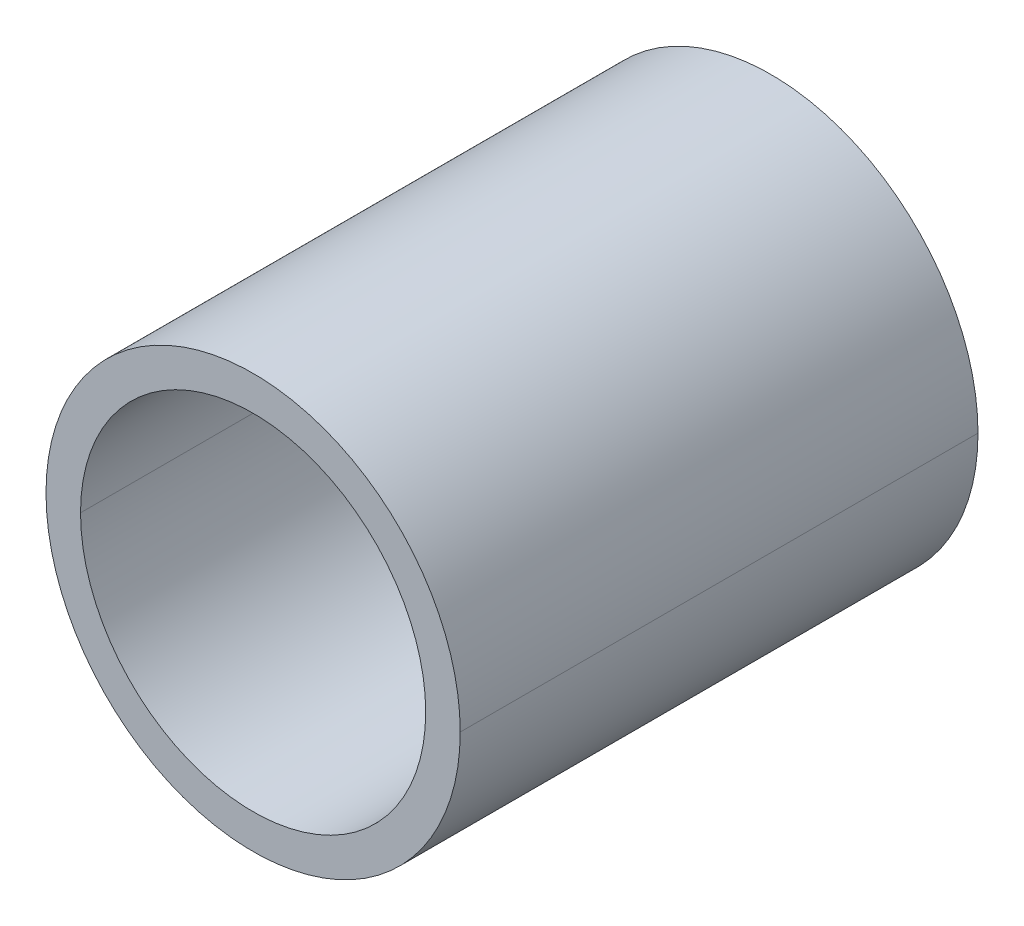
ISO-10303-21;
HEADER;
FILE_DESCRIPTION(('STEP AP214'),'2;1');
FILE_NAME('part.step','',(''),(''),'','','');
FILE_SCHEMA(('AUTOMOTIVE_DESIGN { 1 0 10303 214 1 1 1 1 }'));
ENDSEC;
DATA;
#1=APPLICATION_CONTEXT('core data for automotive mechanical design processes');
#2=APPLICATION_PROTOCOL_DEFINITION('international standard','automotive_design',2000,#1);
#3=PRODUCT_CONTEXT('',#1,'mechanical');
#4=PRODUCT('Part','Part','',(#3));
#5=PRODUCT_RELATED_PRODUCT_CATEGORY('part','',(#4));
#6=PRODUCT_DEFINITION_FORMATION('','',#4);
#7=PRODUCT_DEFINITION_CONTEXT('part definition',#1,'design');
#8=PRODUCT_DEFINITION('design','',#6,#7);
#9=PRODUCT_DEFINITION_SHAPE('','',#8);
#10=(LENGTH_UNIT() NAMED_UNIT(*) SI_UNIT(.MILLI.,.METRE.));
#11=(NAMED_UNIT(*) PLANE_ANGLE_UNIT() SI_UNIT($,.RADIAN.));
#12=(NAMED_UNIT(*) SI_UNIT($,.STERADIAN.) SOLID_ANGLE_UNIT());
#13=UNCERTAINTY_MEASURE_WITH_UNIT(LENGTH_MEASURE(1.E-05),#10,'distance_accuracy_value','');
#14=(GEOMETRIC_REPRESENTATION_CONTEXT(3) GLOBAL_UNCERTAINTY_ASSIGNED_CONTEXT((#13)) GLOBAL_UNIT_ASSIGNED_CONTEXT((#10,
#11,#12)) REPRESENTATION_CONTEXT('',''));
#15=CARTESIAN_POINT('',(0.,0.,0.));
#16=DIRECTION('',(0.,0.,1.));
#17=DIRECTION('',(1.,0.,0.));
#18=AXIS2_PLACEMENT_3D('',#15,#16,#17);
#19=CARTESIAN_POINT('',(0.,0.,15.));
#20=DIRECTION('',(0.,0.,-1.));
#21=DIRECTION('',(-1.,0.,0.));
#22=AXIS2_PLACEMENT_3D('',#19,#20,#21);
#23=CYLINDRICAL_SURFACE('',#22,10.);
#24=DIRECTION('',(0.,0.,-1.));
#25=VECTOR('',#24,1.);
#26=CARTESIAN_POINT('',(10.,0.,15.));
#27=LINE('',#26,#25);
#28=CARTESIAN_POINT('',(10.,0.,15.));
#29=VERTEX_POINT('',#28);
#30=CARTESIAN_POINT('',(10.,0.,-15.));
#31=VERTEX_POINT('',#30);
#32=EDGE_CURVE('E83',#29,#31,#27,.T.);
#33=ORIENTED_EDGE('',*,*,#32,.F.);
#34=CARTESIAN_POINT('',(0.,0.,15.));
#35=DIRECTION('',(0.,0.,1.));
#36=DIRECTION('',(1.,0.,0.));
#37=AXIS2_PLACEMENT_3D('',#34,#35,#36);
#38=CIRCLE('',#37,10.);
#39=CARTESIAN_POINT('',(-10.,0.,15.));
#40=VERTEX_POINT('',#39);
#41=EDGE_CURVE('E75',#29,#40,#38,.T.);
#42=ORIENTED_EDGE('',*,*,#41,.T.);
#43=DIRECTION('',(0.,0.,-1.));
#44=VECTOR('',#43,1.);
#45=CARTESIAN_POINT('',(-10.,0.,15.));
#46=LINE('',#45,#44);
#47=CARTESIAN_POINT('',(-10.,0.,-15.));
#48=VERTEX_POINT('',#47);
#49=EDGE_CURVE('E74',#40,#48,#46,.T.);
#50=ORIENTED_EDGE('',*,*,#49,.T.);
#51=CARTESIAN_POINT('',(0.,0.,-15.));
#52=DIRECTION('',(0.,0.,1.));
#53=DIRECTION('',(1.,0.,0.));
#54=AXIS2_PLACEMENT_3D('',#51,#52,#53);
#55=CIRCLE('',#54,10.);
#56=EDGE_CURVE('E10',#31,#48,#55,.T.);
#57=ORIENTED_EDGE('',*,*,#56,.F.);
#58=EDGE_LOOP('',(#33,#42,#50,#57));
#59=FACE_BOUND('',#58,.T.);
#60=ADVANCED_FACE('F16',(#59),#23,.F.);
#61=CARTESIAN_POINT('',(0.,0.,15.));
#62=DIRECTION('',(0.,0.,-1.));
#63=DIRECTION('',(-1.,0.,0.));
#64=AXIS2_PLACEMENT_3D('',#61,#62,#63);
#65=CYLINDRICAL_SURFACE('',#64,12.);
#66=DIRECTION('',(0.,0.,-1.));
#67=VECTOR('',#66,1.);
#68=CARTESIAN_POINT('',(12.,0.,15.));
#69=LINE('',#68,#67);
#70=CARTESIAN_POINT('',(12.,0.,15.));
#71=VERTEX_POINT('',#70);
#72=CARTESIAN_POINT('',(12.,0.,-15.));
#73=VERTEX_POINT('',#72);
#74=EDGE_CURVE('E96',#71,#73,#69,.T.);
#75=ORIENTED_EDGE('',*,*,#74,.F.);
#76=CARTESIAN_POINT('',(0.,0.,15.));
#77=DIRECTION('',(0.,0.,1.));
#78=DIRECTION('',(1.,0.,0.));
#79=AXIS2_PLACEMENT_3D('',#76,#77,#78);
#80=CIRCLE('',#79,12.);
#81=CARTESIAN_POINT('',(-12.,0.,15.));
#82=VERTEX_POINT('',#81);
#83=EDGE_CURVE('E20',#82,#71,#80,.T.);
#84=ORIENTED_EDGE('',*,*,#83,.F.);
#85=DIRECTION('',(0.,0.,-1.));
#86=VECTOR('',#85,1.);
#87=CARTESIAN_POINT('',(-12.,0.,15.));
#88=LINE('',#87,#86);
#89=CARTESIAN_POINT('',(-12.,0.,-15.));
#90=VERTEX_POINT('',#89);
#91=EDGE_CURVE('E103',#82,#90,#88,.T.);
#92=ORIENTED_EDGE('',*,*,#91,.T.);
#93=CARTESIAN_POINT('',(0.,0.,-15.));
#94=DIRECTION('',(0.,0.,1.));
#95=DIRECTION('',(1.,0.,0.));
#96=AXIS2_PLACEMENT_3D('',#93,#94,#95);
#97=CIRCLE('',#96,12.);
#98=EDGE_CURVE('E27',#90,#73,#97,.T.);
#99=ORIENTED_EDGE('',*,*,#98,.T.);
#100=EDGE_LOOP('',(#75,#84,#92,#99));
#101=FACE_BOUND('',#100,.T.);
#102=ADVANCED_FACE('F188',(#101),#65,.T.);
#103=CARTESIAN_POINT('',(0.,0.,-15.));
#104=DIRECTION('',(0.,0.,1.));
#105=DIRECTION('',(1.,0.,0.));
#106=AXIS2_PLACEMENT_3D('',#103,#104,#105);
#107=PLANE('',#106);
#108=CARTESIAN_POINT('',(0.,0.,-15.));
#109=DIRECTION('',(0.,0.,1.));
#110=DIRECTION('',(1.,0.,0.));
#111=AXIS2_PLACEMENT_3D('',#108,#109,#110);
#112=CIRCLE('',#111,10.);
#113=EDGE_CURVE('E68',#48,#31,#112,.T.);
#114=ORIENTED_EDGE('',*,*,#113,.T.);
#115=ORIENTED_EDGE('',*,*,#56,.T.);
#116=EDGE_LOOP('',(#114,#115));
#117=FACE_BOUND('',#116,.T.);
#118=ORIENTED_EDGE('',*,*,#98,.F.);
#119=CARTESIAN_POINT('',(0.,0.,-15.));
#120=DIRECTION('',(0.,0.,1.));
#121=DIRECTION('',(1.,0.,0.));
#122=AXIS2_PLACEMENT_3D('',#119,#120,#121);
#123=CIRCLE('',#122,12.);
#124=EDGE_CURVE('E102',#73,#90,#123,.T.);
#125=ORIENTED_EDGE('',*,*,#124,.F.);
#126=EDGE_LOOP('',(#118,#125));
#127=FACE_BOUND('',#126,.T.);
#128=ADVANCED_FACE('F18',(#117,#127),#107,.F.);
#129=CARTESIAN_POINT('',(0.,0.,15.));
#130=DIRECTION('',(0.,0.,1.));
#131=DIRECTION('',(1.,0.,0.));
#132=AXIS2_PLACEMENT_3D('',#129,#130,#131);
#133=PLANE('',#132);
#134=CARTESIAN_POINT('',(0.,0.,15.));
#135=DIRECTION('',(0.,0.,1.));
#136=DIRECTION('',(1.,0.,0.));
#137=AXIS2_PLACEMENT_3D('',#134,#135,#136);
#138=CIRCLE('',#137,10.);
#139=EDGE_CURVE('E89',#40,#29,#138,.T.);
#140=ORIENTED_EDGE('',*,*,#139,.F.);
#141=ORIENTED_EDGE('',*,*,#41,.F.);
#142=EDGE_LOOP('',(#140,#141));
#143=FACE_BOUND('',#142,.T.);
#144=ORIENTED_EDGE('',*,*,#83,.T.);
#145=CARTESIAN_POINT('',(0.,0.,15.));
#146=DIRECTION('',(0.,0.,1.));
#147=DIRECTION('',(1.,0.,0.));
#148=AXIS2_PLACEMENT_3D('',#145,#146,#147);
#149=CIRCLE('',#148,12.);
#150=EDGE_CURVE('E80',#71,#82,#149,.T.);
#151=ORIENTED_EDGE('',*,*,#150,.T.);
#152=EDGE_LOOP('',(#144,#151));
#153=FACE_BOUND('',#152,.T.);
#154=ADVANCED_FACE('F117',(#143,#153),#133,.T.);
#155=CARTESIAN_POINT('',(0.,0.,15.));
#156=DIRECTION('',(0.,0.,-1.));
#157=DIRECTION('',(-1.,0.,0.));
#158=AXIS2_PLACEMENT_3D('',#155,#156,#157);
#159=CYLINDRICAL_SURFACE('',#158,12.);
#160=ORIENTED_EDGE('',*,*,#150,.F.);
#161=ORIENTED_EDGE('',*,*,#74,.T.);
#162=ORIENTED_EDGE('',*,*,#124,.T.);
#163=ORIENTED_EDGE('',*,*,#91,.F.);
#164=EDGE_LOOP('',(#160,#161,#162,#163));
#165=FACE_BOUND('',#164,.T.);
#166=ADVANCED_FACE('F195',(#165),#159,.T.);
#167=CARTESIAN_POINT('',(0.,0.,15.));
#168=DIRECTION('',(0.,0.,-1.));
#169=DIRECTION('',(-1.,0.,0.));
#170=AXIS2_PLACEMENT_3D('',#167,#168,#169);
#171=CYLINDRICAL_SURFACE('',#170,10.);
#172=ORIENTED_EDGE('',*,*,#139,.T.);
#173=ORIENTED_EDGE('',*,*,#32,.T.);
#174=ORIENTED_EDGE('',*,*,#113,.F.);
#175=ORIENTED_EDGE('',*,*,#49,.F.);
#176=EDGE_LOOP('',(#172,#173,#174,#175));
#177=FACE_BOUND('',#176,.T.);
#178=ADVANCED_FACE('F82',(#177),#171,.F.);
#179=CLOSED_SHELL('',(#60,#102,#128,#154,#166,#178));
#180=MANIFOLD_SOLID_BREP('B1',#179);
#181=ADVANCED_BREP_SHAPE_REPRESENTATION('',(#18,#180),#14);
#182=SHAPE_DEFINITION_REPRESENTATION(#9,#181);
ENDSEC;
END-ISO-10303-21;
